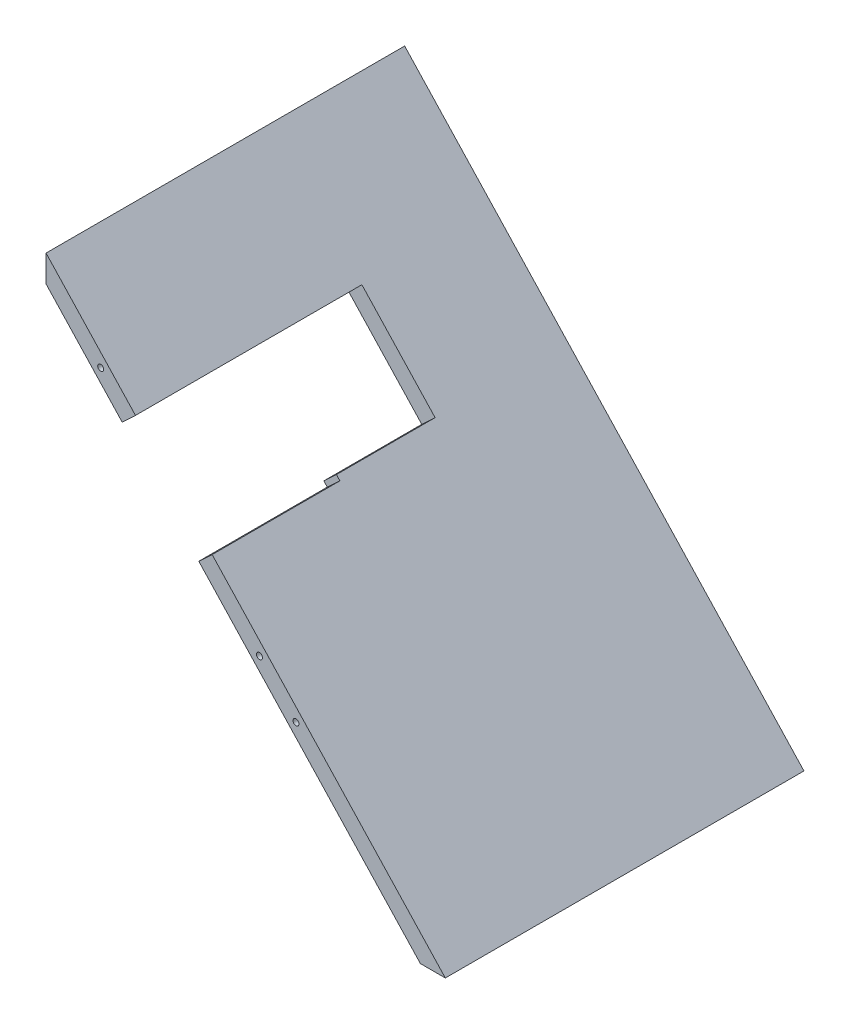
ISO-10303-21;
HEADER;
FILE_DESCRIPTION(('STEP AP214'),'2;1');
FILE_NAME('part.step','',(''),(''),'','','');
FILE_SCHEMA(('AUTOMOTIVE_DESIGN { 1 0 10303 214 1 1 1 1 }'));
ENDSEC;
DATA;
#1=APPLICATION_CONTEXT('core data for automotive mechanical design processes');
#2=APPLICATION_PROTOCOL_DEFINITION('international standard','automotive_design',2000,#1);
#3=PRODUCT_CONTEXT('',#1,'mechanical');
#4=PRODUCT('Part','Part','',(#3));
#5=PRODUCT_RELATED_PRODUCT_CATEGORY('part','',(#4));
#6=PRODUCT_DEFINITION_FORMATION('','',#4);
#7=PRODUCT_DEFINITION_CONTEXT('part definition',#1,'design');
#8=PRODUCT_DEFINITION('design','',#6,#7);
#9=PRODUCT_DEFINITION_SHAPE('','',#8);
#10=(LENGTH_UNIT() NAMED_UNIT(*) SI_UNIT(.MILLI.,.METRE.));
#11=(NAMED_UNIT(*) PLANE_ANGLE_UNIT() SI_UNIT($,.RADIAN.));
#12=(NAMED_UNIT(*) SI_UNIT($,.STERADIAN.) SOLID_ANGLE_UNIT());
#13=UNCERTAINTY_MEASURE_WITH_UNIT(LENGTH_MEASURE(1.E-05),#10,'distance_accuracy_value','');
#14=(GEOMETRIC_REPRESENTATION_CONTEXT(3) GLOBAL_UNCERTAINTY_ASSIGNED_CONTEXT((#13)) GLOBAL_UNIT_ASSIGNED_CONTEXT((#10,
#11,#12)) REPRESENTATION_CONTEXT('',''));
#15=CARTESIAN_POINT('',(0.,0.,0.));
#16=DIRECTION('',(0.,0.,1.));
#17=DIRECTION('',(1.,0.,0.));
#18=AXIS2_PLACEMENT_3D('',#15,#16,#17);
#19=CARTESIAN_POINT('',(0.,0.,170.18));
#20=DIRECTION('',(0.,0.,1.));
#21=DIRECTION('',(1.,0.,0.));
#22=AXIS2_PLACEMENT_3D('',#19,#20,#21);
#23=PLANE('',#22);
#24=CARTESIAN_POINT('',(25.9284937613539,169.045094592254,170.18));
#25=DIRECTION('',(0.,0.,1.));
#26=DIRECTION('',(1.,0.,0.));
#27=AXIS2_PLACEMENT_3D('',#24,#25,#26);
#28=CIRCLE('',#27,1.4224);
#29=CARTESIAN_POINT('',(27.3508937613539,169.045094592254,170.18));
#30=VERTEX_POINT('',#29);
#31=EDGE_CURVE('E322',#30,#30,#28,.T.);
#32=ORIENTED_EDGE('',*,*,#31,.F.);
#33=EDGE_LOOP('',(#32));
#34=FACE_BOUND('',#33,.T.);
#35=DIRECTION('',(-0.731353701619167,-0.681998360062503,0.));
#36=VECTOR('',#35,1.);
#37=CARTESIAN_POINT('',(-58.9117495597087,63.1751168806413,170.18));
#38=LINE('',#37,#36);
#39=CARTESIAN_POINT('',(42.4407579466896,157.687859148239,170.18));
#40=VERTEX_POINT('',#39);
#41=CARTESIAN_POINT('',(36.1062262275397,151.780812756514,170.18));
#42=VERTEX_POINT('',#41);
#43=EDGE_CURVE('E56',#40,#42,#38,.T.);
#44=ORIENTED_EDGE('',*,*,#43,.F.);
#45=DIRECTION('',(0.681998360062503,-0.731353701619167,0.));
#46=VECTOR('',#45,1.);
#47=CARTESIAN_POINT('',(101.352507506398,94.512742267598,170.18));
#48=LINE('',#47,#46);
#49=CARTESIAN_POINT('',(0.,203.2,170.18));
#50=VERTEX_POINT('',#49);
#51=EDGE_CURVE('E199',#50,#40,#48,.T.);
#52=ORIENTED_EDGE('',*,*,#51,.F.);
#53=DIRECTION('',(0.,1.,0.));
#54=VECTOR('',#53,1.);
#55=CARTESIAN_POINT('',(0.,0.,170.18));
#56=LINE('',#55,#54);
#57=CARTESIAN_POINT('',(0.,190.5,170.18));
#58=VERTEX_POINT('',#57);
#59=EDGE_CURVE('E203',#58,#50,#56,.T.);
#60=ORIENTED_EDGE('',*,*,#59,.F.);
#61=DIRECTION('',(-0.681998360062502,0.731353701619167,0.));
#62=VECTOR('',#61,1.);
#63=CARTESIAN_POINT('',(95.0179757872483,88.6056958758731,170.18));
#64=LINE('',#63,#62);
#65=EDGE_CURVE('E207',#42,#58,#64,.T.);
#66=ORIENTED_EDGE('',*,*,#65,.F.);
#67=EDGE_LOOP('',(#44,#52,#60,#66));
#68=FACE_BOUND('',#67,.T.);
#69=ADVANCED_FACE('F47',(#34,#68),#23,.T.);
#70=CARTESIAN_POINT('',(0.,0.,170.18));
#71=DIRECTION('',(0.,-1.,0.));
#72=DIRECTION('',(1.,0.,0.));
#73=AXIS2_PLACEMENT_3D('',#70,#71,#72);
#74=PLANE('',#73);
#75=DIRECTION('',(-1.,0.,0.));
#76=VECTOR('',#75,1.);
#77=CARTESIAN_POINT('',(0.,0.,0.));
#78=LINE('',#77,#76);
#79=CARTESIAN_POINT('',(189.487065503175,0.,0.));
#80=VERTEX_POINT('',#79);
#81=CARTESIAN_POINT('',(177.644123909226,0.,0.));
#82=VERTEX_POINT('',#81);
#83=EDGE_CURVE('E192',#80,#82,#78,.T.);
#84=ORIENTED_EDGE('',*,*,#83,.F.);
#85=DIRECTION('',(0.,0.,-1.));
#86=VECTOR('',#85,1.);
#87=CARTESIAN_POINT('',(189.487065503175,0.,170.18));
#88=LINE('',#87,#86);
#89=CARTESIAN_POINT('',(189.487065503175,0.,170.18));
#90=VERTEX_POINT('',#89);
#91=EDGE_CURVE('E235',#90,#80,#88,.T.);
#92=ORIENTED_EDGE('',*,*,#91,.F.);
#93=DIRECTION('',(-1.,0.,0.));
#94=VECTOR('',#93,1.);
#95=CARTESIAN_POINT('',(0.,0.,170.18));
#96=LINE('',#95,#94);
#97=CARTESIAN_POINT('',(177.644123909226,0.,170.18));
#98=VERTEX_POINT('',#97);
#99=EDGE_CURVE('E193',#90,#98,#96,.T.);
#100=ORIENTED_EDGE('',*,*,#99,.T.);
#101=DIRECTION('',(0.,0.,-1.));
#102=VECTOR('',#101,1.);
#103=CARTESIAN_POINT('',(177.644123909226,0.,170.18));
#104=LINE('',#103,#102);
#105=EDGE_CURVE('E212',#98,#82,#104,.T.);
#106=ORIENTED_EDGE('',*,*,#105,.T.);
#107=EDGE_LOOP('',(#84,#92,#100,#106));
#108=FACE_BOUND('',#107,.T.);
#109=ADVANCED_FACE('F49',(#108),#74,.T.);
#110=CARTESIAN_POINT('',(101.352507506398,94.512742267598,170.18));
#111=DIRECTION('',(0.731353701619167,0.681998360062503,0.));
#112=DIRECTION('',(-0.681998360062503,0.731353701619167,0.));
#113=AXIS2_PLACEMENT_3D('',#110,#111,#112);
#114=PLANE('',#113);
#115=DIRECTION('',(-0.681998360062503,0.731353701619167,0.));
#116=VECTOR('',#115,1.);
#117=CARTESIAN_POINT('',(42.4407579466896,157.687859148239,62.738));
#118=LINE('',#117,#116);
#119=CARTESIAN_POINT('',(77.1804617097782,120.434087837177,62.738));
#120=VERTEX_POINT('',#119);
#121=CARTESIAN_POINT('',(42.4407579466896,157.687859148239,62.738));
#122=VERTEX_POINT('',#121);
#123=EDGE_CURVE('E173',#120,#122,#118,.T.);
#124=ORIENTED_EDGE('',*,*,#123,.F.);
#125=DIRECTION('',(0.,0.,1.));
#126=VECTOR('',#125,1.);
#127=CARTESIAN_POINT('',(77.1804617097782,120.434087837177,62.738));
#128=LINE('',#127,#126);
#129=CARTESIAN_POINT('',(77.1804617097782,120.434087837177,109.559602835523));
#130=VERTEX_POINT('',#129);
#131=EDGE_CURVE('E160',#120,#130,#128,.T.);
#132=ORIENTED_EDGE('',*,*,#131,.T.);
#133=DIRECTION('',(0.681998360062503,-0.731353701619166,0.));
#134=VECTOR('',#133,1.);
#135=CARTESIAN_POINT('',(78.8185504724235,118.677452703873,109.559602835523));
#136=LINE('',#135,#134);
#137=CARTESIAN_POINT('',(78.8185504724235,118.677452703873,109.559602835523));
#138=VERTEX_POINT('',#137);
#139=EDGE_CURVE('E136',#130,#138,#136,.T.);
#140=ORIENTED_EDGE('',*,*,#139,.T.);
#141=DIRECTION('',(0.,0.,-1.));
#142=VECTOR('',#141,1.);
#143=CARTESIAN_POINT('',(78.8185504724235,118.677452703873,170.18));
#144=LINE('',#143,#142);
#145=CARTESIAN_POINT('',(78.8185504724235,118.677452703873,170.18));
#146=VERTEX_POINT('',#145);
#147=EDGE_CURVE('E167',#146,#138,#144,.T.);
#148=ORIENTED_EDGE('',*,*,#147,.F.);
#149=EDGE_CURVE('E197',#146,#90,#48,.T.);
#150=ORIENTED_EDGE('',*,*,#149,.T.);
#151=ORIENTED_EDGE('',*,*,#91,.T.);
#152=DIRECTION('',(0.681998360062503,-0.731353701619167,0.));
#153=VECTOR('',#152,1.);
#154=CARTESIAN_POINT('',(101.352507506398,94.512742267598,0.));
#155=LINE('',#154,#153);
#156=CARTESIAN_POINT('',(0.,203.2,0.));
#157=VERTEX_POINT('',#156);
#158=EDGE_CURVE('E216',#157,#80,#155,.T.);
#159=ORIENTED_EDGE('',*,*,#158,.F.);
#160=DIRECTION('',(0.,0.,-1.));
#161=VECTOR('',#160,1.);
#162=CARTESIAN_POINT('',(0.,203.2,170.18));
#163=LINE('',#162,#161);
#164=EDGE_CURVE('E232',#50,#157,#163,.T.);
#165=ORIENTED_EDGE('',*,*,#164,.F.);
#166=ORIENTED_EDGE('',*,*,#51,.T.);
#167=DIRECTION('',(0.,0.,1.));
#168=VECTOR('',#167,1.);
#169=CARTESIAN_POINT('',(42.4407579466896,157.687859148239,170.18));
#170=LINE('',#169,#168);
#171=EDGE_CURVE('E176',#122,#40,#170,.T.);
#172=ORIENTED_EDGE('',*,*,#171,.F.);
#173=EDGE_LOOP('',(#124,#132,#140,#148,#150,#151,#159,#165,#166,#172));
#174=FACE_BOUND('',#173,.T.);
#175=ADVANCED_FACE('F262',(#174),#114,.T.);
#176=CARTESIAN_POINT('',(0.,0.,170.18));
#177=DIRECTION('',(-1.,0.,0.));
#178=DIRECTION('',(0.,0.,1.));
#179=AXIS2_PLACEMENT_3D('',#176,#177,#178);
#180=PLANE('',#179);
#181=DIRECTION('',(0.,1.,0.));
#182=VECTOR('',#181,1.);
#183=CARTESIAN_POINT('',(0.,0.,0.));
#184=LINE('',#183,#182);
#185=CARTESIAN_POINT('',(0.,190.5,0.));
#186=VERTEX_POINT('',#185);
#187=EDGE_CURVE('E220',#186,#157,#184,.T.);
#188=ORIENTED_EDGE('',*,*,#187,.F.);
#189=DIRECTION('',(0.,0.,-1.));
#190=VECTOR('',#189,1.);
#191=CARTESIAN_POINT('',(0.,190.5,170.18));
#192=LINE('',#191,#190);
#193=EDGE_CURVE('E229',#58,#186,#192,.T.);
#194=ORIENTED_EDGE('',*,*,#193,.F.);
#195=ORIENTED_EDGE('',*,*,#59,.T.);
#196=ORIENTED_EDGE('',*,*,#164,.T.);
#197=EDGE_LOOP('',(#188,#194,#195,#196));
#198=FACE_BOUND('',#197,.T.);
#199=ADVANCED_FACE('F276',(#198),#180,.T.);
#200=CARTESIAN_POINT('',(95.0179757872483,88.6056958758731,170.18));
#201=DIRECTION('',(-0.731353701619167,-0.681998360062502,0.));
#202=DIRECTION('',(0.681998360062502,-0.731353701619167,0.));
#203=AXIS2_PLACEMENT_3D('',#200,#201,#202);
#204=PLANE('',#203);
#205=DIRECTION('',(0.,0.,-1.));
#206=VECTOR('',#205,1.);
#207=CARTESIAN_POINT('',(36.1062262275396,151.780812756514,170.18));
#208=LINE('',#207,#206);
#209=CARTESIAN_POINT('',(36.1062262275396,151.780812756514,62.738));
#210=VERTEX_POINT('',#209);
#211=EDGE_CURVE('E189',#42,#210,#208,.T.);
#212=ORIENTED_EDGE('',*,*,#211,.F.);
#213=ORIENTED_EDGE('',*,*,#65,.T.);
#214=ORIENTED_EDGE('',*,*,#193,.T.);
#215=DIRECTION('',(-0.681998360062502,0.731353701619167,0.));
#216=VECTOR('',#215,1.);
#217=CARTESIAN_POINT('',(95.0179757872483,88.6056958758731,0.));
#218=LINE('',#217,#216);
#219=EDGE_CURVE('E198',#82,#186,#218,.T.);
#220=ORIENTED_EDGE('',*,*,#219,.F.);
#221=ORIENTED_EDGE('',*,*,#105,.F.);
#222=CARTESIAN_POINT('',(72.4840187532735,112.770406312148,170.18));
#223=VERTEX_POINT('',#222);
#224=EDGE_CURVE('E208',#98,#223,#64,.T.);
#225=ORIENTED_EDGE('',*,*,#224,.T.);
#226=DIRECTION('',(0.,0.,1.));
#227=VECTOR('',#226,1.);
#228=CARTESIAN_POINT('',(72.4840187532735,112.770406312148,170.18));
#229=LINE('',#228,#227);
#230=CARTESIAN_POINT('',(72.4840187532735,112.770406312148,62.738));
#231=VERTEX_POINT('',#230);
#232=EDGE_CURVE('E184',#231,#223,#229,.T.);
#233=ORIENTED_EDGE('',*,*,#232,.F.);
#234=DIRECTION('',(0.681998360062502,-0.731353701619167,0.));
#235=VECTOR('',#234,1.);
#236=CARTESIAN_POINT('',(95.0179757872483,88.6056958758731,62.738));
#237=LINE('',#236,#235);
#238=EDGE_CURVE('E11',#210,#231,#237,.T.);
#239=ORIENTED_EDGE('',*,*,#238,.F.);
#240=EDGE_LOOP('',(#212,#213,#214,#220,#221,#225,#233,#239));
#241=FACE_BOUND('',#240,.T.);
#242=ADVANCED_FACE('F252',(#241),#204,.T.);
#243=CARTESIAN_POINT('',(101.28249256466,88.2378241003525,170.18));
#244=DIRECTION('',(0.,0.,1.));
#245=DIRECTION('',(1.,0.,0.));
#246=AXIS2_PLACEMENT_3D('',#243,#244,#245);
#247=CIRCLE('',#246,1.42240000000001);
#248=CARTESIAN_POINT('',(102.70489256466,88.2378241003525,170.18));
#249=VERTEX_POINT('',#248);
#250=EDGE_CURVE('E304',#249,#249,#247,.T.);
#251=ORIENTED_EDGE('',*,*,#250,.F.);
#252=EDGE_LOOP('',(#251));
#253=FACE_BOUND('',#252,.T.);
#254=CARTESIAN_POINT('',(118.605250910247,69.6614400792256,170.18));
#255=DIRECTION('',(0.,0.,1.));
#256=DIRECTION('',(1.,0.,0.));
#257=AXIS2_PLACEMENT_3D('',#254,#255,#256);
#258=CIRCLE('',#257,1.42240000000002);
#259=CARTESIAN_POINT('',(120.027650910247,69.6614400792256,170.18));
#260=VERTEX_POINT('',#259);
#261=EDGE_CURVE('E307',#260,#260,#258,.T.);
#262=ORIENTED_EDGE('',*,*,#261,.F.);
#263=EDGE_LOOP('',(#262));
#264=FACE_BOUND('',#263,.T.);
#265=DIRECTION('',(0.731353701619167,0.681998360062503,0.));
#266=VECTOR('',#265,1.);
#267=CARTESIAN_POINT('',(-22.5339570339748,24.1647104362749,170.18));
#268=LINE('',#267,#266);
#269=EDGE_CURVE('E238',#223,#146,#268,.T.);
#270=ORIENTED_EDGE('',*,*,#269,.F.);
#271=ORIENTED_EDGE('',*,*,#224,.F.);
#272=ORIENTED_EDGE('',*,*,#99,.F.);
#273=ORIENTED_EDGE('',*,*,#149,.F.);
#274=EDGE_LOOP('',(#270,#271,#272,#273));
#275=FACE_BOUND('',#274,.T.);
#276=ADVANCED_FACE('F270',(#253,#264,#275),#23,.T.);
#277=CARTESIAN_POINT('',(0.,0.,0.));
#278=DIRECTION('',(0.,0.,1.));
#279=DIRECTION('',(1.,0.,0.));
#280=AXIS2_PLACEMENT_3D('',#277,#278,#279);
#281=PLANE('',#280);
#282=CARTESIAN_POINT('',(25.9284937613539,169.045094592254,0.));
#283=DIRECTION('',(0.,0.,1.));
#284=DIRECTION('',(1.,0.,0.));
#285=AXIS2_PLACEMENT_3D('',#282,#283,#284);
#286=CIRCLE('',#285,1.4224);
#287=CARTESIAN_POINT('',(27.3508937613539,169.045094592254,0.));
#288=VERTEX_POINT('',#287);
#289=EDGE_CURVE('E345',#288,#288,#286,.T.);
#290=ORIENTED_EDGE('',*,*,#289,.T.);
#291=EDGE_LOOP('',(#290));
#292=FACE_BOUND('',#291,.T.);
#293=CARTESIAN_POINT('',(101.28249256466,88.2378241003525,0.));
#294=DIRECTION('',(0.,0.,1.));
#295=DIRECTION('',(1.,0.,0.));
#296=AXIS2_PLACEMENT_3D('',#293,#294,#295);
#297=CIRCLE('',#296,1.42240000000001);
#298=CARTESIAN_POINT('',(102.70489256466,88.2378241003525,0.));
#299=VERTEX_POINT('',#298);
#300=EDGE_CURVE('E337',#299,#299,#297,.T.);
#301=ORIENTED_EDGE('',*,*,#300,.T.);
#302=EDGE_LOOP('',(#301));
#303=FACE_BOUND('',#302,.T.);
#304=CARTESIAN_POINT('',(118.605250910247,69.6614400792256,0.));
#305=DIRECTION('',(0.,0.,1.));
#306=DIRECTION('',(1.,0.,0.));
#307=AXIS2_PLACEMENT_3D('',#304,#305,#306);
#308=CIRCLE('',#307,1.42240000000002);
#309=CARTESIAN_POINT('',(120.027650910247,69.6614400792256,0.));
#310=VERTEX_POINT('',#309);
#311=EDGE_CURVE('E329',#310,#310,#308,.T.);
#312=ORIENTED_EDGE('',*,*,#311,.T.);
#313=EDGE_LOOP('',(#312));
#314=FACE_BOUND('',#313,.T.);
#315=ORIENTED_EDGE('',*,*,#83,.T.);
#316=ORIENTED_EDGE('',*,*,#219,.T.);
#317=ORIENTED_EDGE('',*,*,#187,.T.);
#318=ORIENTED_EDGE('',*,*,#158,.T.);
#319=EDGE_LOOP('',(#315,#316,#317,#318));
#320=FACE_BOUND('',#319,.T.);
#321=ADVANCED_FACE('F273',(#292,#303,#314,#320),#281,.F.);
#322=CARTESIAN_POINT('',(-82.0210149948602,41.6253782328026,170.18));
#323=DIRECTION('',(-0.681998360062503,0.731353701619167,0.));
#324=DIRECTION('',(-0.731353701619167,-0.681998360062503,0.));
#325=AXIS2_PLACEMENT_3D('',#322,#323,#324);
#326=PLANE('',#325);
#327=ORIENTED_EDGE('',*,*,#211,.T.);
#328=DIRECTION('',(0.731353701619167,0.681998360062503,0.));
#329=VECTOR('',#328,1.);
#330=CARTESIAN_POINT('',(-82.0210149948602,41.6253782328026,62.738));
#331=LINE('',#330,#329);
#332=EDGE_CURVE('E180',#210,#122,#331,.T.);
#333=ORIENTED_EDGE('',*,*,#332,.T.);
#334=ORIENTED_EDGE('',*,*,#171,.T.);
#335=ORIENTED_EDGE('',*,*,#43,.T.);
#336=EDGE_LOOP('',(#327,#333,#334,#335));
#337=FACE_BOUND('',#336,.T.);
#338=ADVANCED_FACE('F244',(#337),#326,.F.);
#339=CARTESIAN_POINT('',(-82.0210149948602,41.6253782328026,62.738));
#340=DIRECTION('',(0.,0.,-1.));
#341=DIRECTION('',(-1.,0.,0.));
#342=AXIS2_PLACEMENT_3D('',#339,#340,#341);
#343=PLANE('',#342);
#344=DIRECTION('',(-0.681998360062503,0.731353701619166,0.));
#345=VECTOR('',#344,1.);
#346=CARTESIAN_POINT('',(72.8555312016417,113.116847274939,62.738));
#347=LINE('',#346,#345);
#348=CARTESIAN_POINT('',(72.8555312016418,113.116847274939,62.738));
#349=VERTEX_POINT('',#348);
#350=CARTESIAN_POINT('',(71.2174424389965,114.873482408243,62.738));
#351=VERTEX_POINT('',#350);
#352=EDGE_CURVE('E63',#349,#351,#347,.T.);
#353=ORIENTED_EDGE('',*,*,#352,.T.);
#354=DIRECTION('',(0.731353701619167,0.681998360062503,0.));
#355=VECTOR('',#354,1.);
#356=CARTESIAN_POINT('',(71.2174424389965,114.873482408243,62.738));
#357=LINE('',#356,#355);
#358=EDGE_CURVE('E67',#351,#120,#357,.T.);
#359=ORIENTED_EDGE('',*,*,#358,.T.);
#360=ORIENTED_EDGE('',*,*,#123,.T.);
#361=ORIENTED_EDGE('',*,*,#332,.F.);
#362=ORIENTED_EDGE('',*,*,#238,.T.);
#363=DIRECTION('',(0.731353701619167,0.681998360062503,0.));
#364=VECTOR('',#363,1.);
#365=CARTESIAN_POINT('',(-45.6432224691263,2.61497178843624,62.738));
#366=LINE('',#365,#364);
#367=EDGE_CURVE('E179',#231,#349,#366,.T.);
#368=ORIENTED_EDGE('',*,*,#367,.T.);
#369=EDGE_LOOP('',(#353,#359,#360,#361,#362,#368));
#370=FACE_BOUND('',#369,.T.);
#371=ADVANCED_FACE('F411',(#370),#343,.F.);
#372=CARTESIAN_POINT('',(-45.6432224691263,2.61497178843624,170.18));
#373=DIRECTION('',(0.681998360062503,-0.731353701619167,0.));
#374=DIRECTION('',(0.731353701619167,0.681998360062503,0.));
#375=AXIS2_PLACEMENT_3D('',#372,#373,#374);
#376=PLANE('',#375);
#377=ORIENTED_EDGE('',*,*,#147,.T.);
#378=DIRECTION('',(0.731353701619167,0.681998360062503,0.));
#379=VECTOR('',#378,1.);
#380=CARTESIAN_POINT('',(72.8555312016417,113.116847274939,109.559602835523));
#381=LINE('',#380,#379);
#382=CARTESIAN_POINT('',(72.8555312016417,113.116847274939,109.559602835523));
#383=VERTEX_POINT('',#382);
#384=EDGE_CURVE('E142',#383,#138,#381,.T.);
#385=ORIENTED_EDGE('',*,*,#384,.F.);
#386=DIRECTION('',(0.,0.,-1.));
#387=VECTOR('',#386,1.);
#388=CARTESIAN_POINT('',(72.8555312016417,113.116847274939,62.738));
#389=LINE('',#388,#387);
#390=EDGE_CURVE('E148',#383,#349,#389,.T.);
#391=ORIENTED_EDGE('',*,*,#390,.T.);
#392=ORIENTED_EDGE('',*,*,#367,.F.);
#393=ORIENTED_EDGE('',*,*,#232,.T.);
#394=ORIENTED_EDGE('',*,*,#269,.T.);
#395=EDGE_LOOP('',(#377,#385,#391,#392,#393,#394));
#396=FACE_BOUND('',#395,.T.);
#397=ADVANCED_FACE('F406',(#396),#376,.F.);
#398=CARTESIAN_POINT('',(72.8555312016417,113.116847274939,109.559602835523));
#399=DIRECTION('',(0.,0.,1.));
#400=DIRECTION('',(1.,0.,0.));
#401=AXIS2_PLACEMENT_3D('',#398,#399,#400);
#402=PLANE('',#401);
#403=ORIENTED_EDGE('',*,*,#139,.F.);
#404=DIRECTION('',(0.731353701619167,0.681998360062503,0.));
#405=VECTOR('',#404,1.);
#406=CARTESIAN_POINT('',(71.2174424389965,114.873482408243,109.559602835523));
#407=LINE('',#406,#405);
#408=CARTESIAN_POINT('',(71.2174424389965,114.873482408243,109.559602835523));
#409=VERTEX_POINT('',#408);
#410=EDGE_CURVE('E129',#409,#130,#407,.T.);
#411=ORIENTED_EDGE('',*,*,#410,.F.);
#412=DIRECTION('',(0.681998360062503,-0.731353701619166,0.));
#413=VECTOR('',#412,1.);
#414=CARTESIAN_POINT('',(72.8555312016417,113.116847274939,109.559602835523));
#415=LINE('',#414,#413);
#416=EDGE_CURVE('E133',#409,#383,#415,.T.);
#417=ORIENTED_EDGE('',*,*,#416,.T.);
#418=ORIENTED_EDGE('',*,*,#384,.T.);
#419=EDGE_LOOP('',(#403,#411,#417,#418));
#420=FACE_BOUND('',#419,.T.);
#421=ADVANCED_FACE('F131',(#420),#402,.T.);
#422=CARTESIAN_POINT('',(71.2174424389965,114.873482408243,62.738));
#423=DIRECTION('',(-0.681998360062503,0.731353701619167,0.));
#424=DIRECTION('',(-0.731353701619167,-0.681998360062503,0.));
#425=AXIS2_PLACEMENT_3D('',#422,#423,#424);
#426=PLANE('',#425);
#427=ORIENTED_EDGE('',*,*,#131,.F.);
#428=ORIENTED_EDGE('',*,*,#358,.F.);
#429=DIRECTION('',(0.,0.,1.));
#430=VECTOR('',#429,1.);
#431=CARTESIAN_POINT('',(71.2174424389965,114.873482408243,62.738));
#432=LINE('',#431,#430);
#433=EDGE_CURVE('E147',#351,#409,#432,.T.);
#434=ORIENTED_EDGE('',*,*,#433,.T.);
#435=ORIENTED_EDGE('',*,*,#410,.T.);
#436=EDGE_LOOP('',(#427,#428,#434,#435));
#437=FACE_BOUND('',#436,.T.);
#438=ADVANCED_FACE('F151',(#437),#426,.T.);
#439=CARTESIAN_POINT('',(95.3894882356165,88.9521368386645,0.));
#440=DIRECTION('',(0.731353701619166,0.681998360062503,0.));
#441=DIRECTION('',(-0.681998360062503,0.731353701619166,0.));
#442=AXIS2_PLACEMENT_3D('',#439,#440,#441);
#443=PLANE('',#442);
#444=ORIENTED_EDGE('',*,*,#352,.F.);
#445=ORIENTED_EDGE('',*,*,#390,.F.);
#446=ORIENTED_EDGE('',*,*,#416,.F.);
#447=ORIENTED_EDGE('',*,*,#433,.F.);
#448=EDGE_LOOP('',(#444,#445,#446,#447));
#449=FACE_BOUND('',#448,.T.);
#450=ADVANCED_FACE('F146',(#449),#443,.F.);
#451=CARTESIAN_POINT('',(118.605250910247,69.6614400792256,160.02));
#452=DIRECTION('',(0.,0.,1.));
#453=DIRECTION('',(1.,0.,0.));
#454=AXIS2_PLACEMENT_3D('',#451,#452,#453);
#455=CYLINDRICAL_SURFACE('',#454,1.42240000000002);
#456=CARTESIAN_POINT('',(118.605250910247,69.6614400792256,160.02));
#457=DIRECTION('',(0.,0.,1.));
#458=DIRECTION('',(1.,0.,0.));
#459=AXIS2_PLACEMENT_3D('',#456,#457,#458);
#460=CIRCLE('',#459,1.42240000000002);
#461=CARTESIAN_POINT('',(120.027650910247,69.6614400792256,160.02));
#462=VERTEX_POINT('',#461);
#463=EDGE_CURVE('E311',#462,#462,#460,.T.);
#464=ORIENTED_EDGE('',*,*,#463,.F.);
#465=EDGE_LOOP('',(#464));
#466=FACE_BOUND('',#465,.T.);
#467=ORIENTED_EDGE('',*,*,#261,.T.);
#468=EDGE_LOOP('',(#467));
#469=FACE_BOUND('',#468,.T.);
#470=ADVANCED_FACE('F397',(#466,#469),#455,.F.);
#471=CARTESIAN_POINT('',(118.605250910247,69.6614400792256,160.02));
#472=DIRECTION('',(0.,0.,1.));
#473=DIRECTION('',(1.,0.,0.));
#474=AXIS2_PLACEMENT_3D('',#471,#472,#473);
#475=PLANE('',#474);
#476=ORIENTED_EDGE('',*,*,#463,.T.);
#477=EDGE_LOOP('',(#476));
#478=FACE_BOUND('',#477,.T.);
#479=ADVANCED_FACE('F392',(#478),#475,.T.);
#480=CARTESIAN_POINT('',(101.28249256466,88.2378241003525,160.02));
#481=DIRECTION('',(0.,0.,1.));
#482=DIRECTION('',(1.,0.,0.));
#483=AXIS2_PLACEMENT_3D('',#480,#481,#482);
#484=CYLINDRICAL_SURFACE('',#483,1.42240000000001);
#485=CARTESIAN_POINT('',(101.28249256466,88.2378241003525,160.02));
#486=DIRECTION('',(0.,0.,1.));
#487=DIRECTION('',(1.,0.,0.));
#488=AXIS2_PLACEMENT_3D('',#485,#486,#487);
#489=CIRCLE('',#488,1.42240000000001);
#490=CARTESIAN_POINT('',(102.70489256466,88.2378241003525,160.02));
#491=VERTEX_POINT('',#490);
#492=EDGE_CURVE('E310',#491,#491,#489,.T.);
#493=ORIENTED_EDGE('',*,*,#492,.F.);
#494=EDGE_LOOP('',(#493));
#495=FACE_BOUND('',#494,.T.);
#496=ORIENTED_EDGE('',*,*,#250,.T.);
#497=EDGE_LOOP('',(#496));
#498=FACE_BOUND('',#497,.T.);
#499=ADVANCED_FACE('F389',(#495,#498),#484,.F.);
#500=CARTESIAN_POINT('',(101.28249256466,88.2378241003525,160.02));
#501=DIRECTION('',(0.,0.,1.));
#502=DIRECTION('',(1.,0.,0.));
#503=AXIS2_PLACEMENT_3D('',#500,#501,#502);
#504=PLANE('',#503);
#505=ORIENTED_EDGE('',*,*,#492,.T.);
#506=EDGE_LOOP('',(#505));
#507=FACE_BOUND('',#506,.T.);
#508=ADVANCED_FACE('F387',(#507),#504,.T.);
#509=CARTESIAN_POINT('',(25.9284937613539,169.045094592254,160.02));
#510=DIRECTION('',(0.,0.,1.));
#511=DIRECTION('',(1.,0.,0.));
#512=AXIS2_PLACEMENT_3D('',#509,#510,#511);
#513=CYLINDRICAL_SURFACE('',#512,1.4224);
#514=CARTESIAN_POINT('',(25.9284937613539,169.045094592254,160.02));
#515=DIRECTION('',(0.,0.,1.));
#516=DIRECTION('',(1.,0.,0.));
#517=AXIS2_PLACEMENT_3D('',#514,#515,#516);
#518=CIRCLE('',#517,1.4224);
#519=CARTESIAN_POINT('',(27.3508937613539,169.045094592254,160.02));
#520=VERTEX_POINT('',#519);
#521=EDGE_CURVE('E163',#520,#520,#518,.T.);
#522=ORIENTED_EDGE('',*,*,#521,.F.);
#523=EDGE_LOOP('',(#522));
#524=FACE_BOUND('',#523,.T.);
#525=ORIENTED_EDGE('',*,*,#31,.T.);
#526=EDGE_LOOP('',(#525));
#527=FACE_BOUND('',#526,.T.);
#528=ADVANCED_FACE('F383',(#524,#527),#513,.F.);
#529=CARTESIAN_POINT('',(25.9284937613539,169.045094592254,160.02));
#530=DIRECTION('',(0.,0.,1.));
#531=DIRECTION('',(1.,0.,0.));
#532=AXIS2_PLACEMENT_3D('',#529,#530,#531);
#533=PLANE('',#532);
#534=ORIENTED_EDGE('',*,*,#521,.T.);
#535=EDGE_LOOP('',(#534));
#536=FACE_BOUND('',#535,.T.);
#537=ADVANCED_FACE('F379',(#536),#533,.T.);
#538=CARTESIAN_POINT('',(118.605250910247,69.6614400792256,10.16));
#539=DIRECTION('',(0.,0.,-1.));
#540=DIRECTION('',(-1.,0.,0.));
#541=AXIS2_PLACEMENT_3D('',#538,#539,#540);
#542=CYLINDRICAL_SURFACE('',#541,1.42240000000002);
#543=CARTESIAN_POINT('',(118.605250910247,69.6614400792256,10.16));
#544=DIRECTION('',(0.,0.,1.));
#545=DIRECTION('',(1.,0.,0.));
#546=AXIS2_PLACEMENT_3D('',#543,#544,#545);
#547=CIRCLE('',#546,1.42240000000002);
#548=CARTESIAN_POINT('',(120.027650910247,69.6614400792256,10.16));
#549=VERTEX_POINT('',#548);
#550=EDGE_CURVE('E333',#549,#549,#547,.T.);
#551=ORIENTED_EDGE('',*,*,#550,.T.);
#552=EDGE_LOOP('',(#551));
#553=FACE_BOUND('',#552,.T.);
#554=ORIENTED_EDGE('',*,*,#311,.F.);
#555=EDGE_LOOP('',(#554));
#556=FACE_BOUND('',#555,.T.);
#557=ADVANCED_FACE('F375',(#553,#556),#542,.F.);
#558=CARTESIAN_POINT('',(118.605250910247,69.6614400792256,10.16));
#559=DIRECTION('',(0.,0.,-1.));
#560=DIRECTION('',(1.,0.,0.));
#561=AXIS2_PLACEMENT_3D('',#558,#559,#560);
#562=PLANE('',#561);
#563=ORIENTED_EDGE('',*,*,#550,.F.);
#564=EDGE_LOOP('',(#563));
#565=FACE_BOUND('',#564,.T.);
#566=ADVANCED_FACE('F371',(#565),#562,.T.);
#567=CARTESIAN_POINT('',(101.28249256466,88.2378241003525,10.16));
#568=DIRECTION('',(0.,0.,-1.));
#569=DIRECTION('',(-1.,0.,0.));
#570=AXIS2_PLACEMENT_3D('',#567,#568,#569);
#571=CYLINDRICAL_SURFACE('',#570,1.42240000000001);
#572=CARTESIAN_POINT('',(101.28249256466,88.2378241003525,10.16));
#573=DIRECTION('',(0.,0.,1.));
#574=DIRECTION('',(1.,0.,0.));
#575=AXIS2_PLACEMENT_3D('',#572,#573,#574);
#576=CIRCLE('',#575,1.42240000000001);
#577=CARTESIAN_POINT('',(102.70489256466,88.2378241003525,10.16));
#578=VERTEX_POINT('',#577);
#579=EDGE_CURVE('E341',#578,#578,#576,.T.);
#580=ORIENTED_EDGE('',*,*,#579,.T.);
#581=EDGE_LOOP('',(#580));
#582=FACE_BOUND('',#581,.T.);
#583=ORIENTED_EDGE('',*,*,#300,.F.);
#584=EDGE_LOOP('',(#583));
#585=FACE_BOUND('',#584,.T.);
#586=ADVANCED_FACE('F367',(#582,#585),#571,.F.);
#587=CARTESIAN_POINT('',(101.28249256466,88.2378241003525,10.16));
#588=DIRECTION('',(0.,0.,-1.));
#589=DIRECTION('',(1.,0.,0.));
#590=AXIS2_PLACEMENT_3D('',#587,#588,#589);
#591=PLANE('',#590);
#592=ORIENTED_EDGE('',*,*,#579,.F.);
#593=EDGE_LOOP('',(#592));
#594=FACE_BOUND('',#593,.T.);
#595=ADVANCED_FACE('F362',(#594),#591,.T.);
#596=CARTESIAN_POINT('',(25.9284937613539,169.045094592254,10.16));
#597=DIRECTION('',(0.,0.,-1.));
#598=DIRECTION('',(-1.,0.,0.));
#599=AXIS2_PLACEMENT_3D('',#596,#597,#598);
#600=CYLINDRICAL_SURFACE('',#599,1.4224);
#601=CARTESIAN_POINT('',(25.9284937613539,169.045094592254,10.16));
#602=DIRECTION('',(0.,0.,1.));
#603=DIRECTION('',(1.,0.,0.));
#604=AXIS2_PLACEMENT_3D('',#601,#602,#603);
#605=CIRCLE('',#604,1.4224);
#606=CARTESIAN_POINT('',(27.3508937613539,169.045094592254,10.16));
#607=VERTEX_POINT('',#606);
#608=EDGE_CURVE('E318',#607,#607,#605,.T.);
#609=ORIENTED_EDGE('',*,*,#608,.T.);
#610=EDGE_LOOP('',(#609));
#611=FACE_BOUND('',#610,.T.);
#612=ORIENTED_EDGE('',*,*,#289,.F.);
#613=EDGE_LOOP('',(#612));
#614=FACE_BOUND('',#613,.T.);
#615=ADVANCED_FACE('F353',(#611,#614),#600,.F.);
#616=CARTESIAN_POINT('',(25.9284937613539,169.045094592254,10.16));
#617=DIRECTION('',(0.,0.,-1.));
#618=DIRECTION('',(1.,0.,0.));
#619=AXIS2_PLACEMENT_3D('',#616,#617,#618);
#620=PLANE('',#619);
#621=ORIENTED_EDGE('',*,*,#608,.F.);
#622=EDGE_LOOP('',(#621));
#623=FACE_BOUND('',#622,.T.);
#624=ADVANCED_FACE('F356',(#623),#620,.T.);
#625=CLOSED_SHELL('',(#69,#109,#175,#199,#242,#276,#321,#338,#371,#397,#421,#438,#450,#470,#479,
#499,#508,#528,#537,#557,#566,#586,#595,#615,#624));
#626=MANIFOLD_SOLID_BREP('B2',#625);
#627=ADVANCED_BREP_SHAPE_REPRESENTATION('',(#18,#626),#14);
#628=SHAPE_DEFINITION_REPRESENTATION(#9,#627);
ENDSEC;
END-ISO-10303-21;
